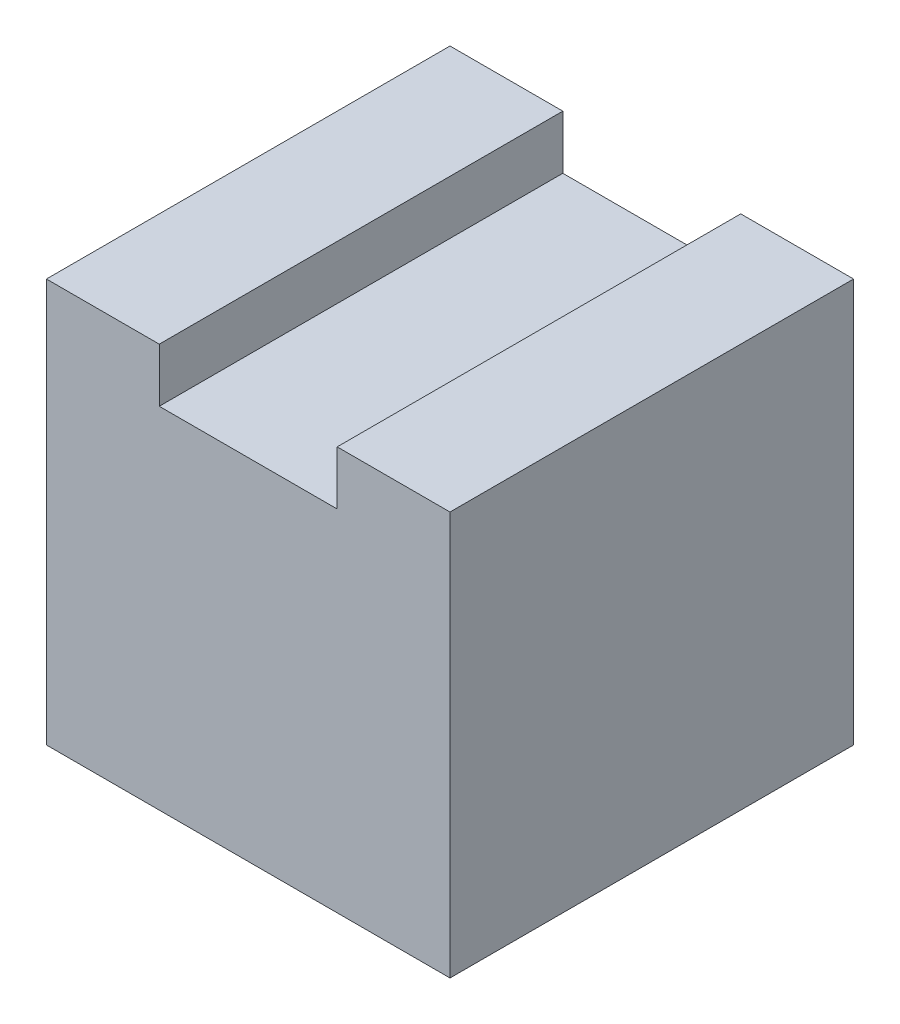
ISO-10303-21;
HEADER;
FILE_DESCRIPTION(('STEP AP214'),'2;1');
FILE_NAME('part.step','',(''),(''),'','','');
FILE_SCHEMA(('AUTOMOTIVE_DESIGN { 1 0 10303 214 1 1 1 1 }'));
ENDSEC;
DATA;
#1=APPLICATION_CONTEXT('core data for automotive mechanical design processes');
#2=APPLICATION_PROTOCOL_DEFINITION('international standard','automotive_design',2000,#1);
#3=PRODUCT_CONTEXT('',#1,'mechanical');
#4=PRODUCT('Part','Part','',(#3));
#5=PRODUCT_RELATED_PRODUCT_CATEGORY('part','',(#4));
#6=PRODUCT_DEFINITION_FORMATION('','',#4);
#7=PRODUCT_DEFINITION_CONTEXT('part definition',#1,'design');
#8=PRODUCT_DEFINITION('design','',#6,#7);
#9=PRODUCT_DEFINITION_SHAPE('','',#8);
#10=(LENGTH_UNIT() NAMED_UNIT(*) SI_UNIT(.MILLI.,.METRE.));
#11=(NAMED_UNIT(*) PLANE_ANGLE_UNIT() SI_UNIT($,.RADIAN.));
#12=(NAMED_UNIT(*) SI_UNIT($,.STERADIAN.) SOLID_ANGLE_UNIT());
#13=UNCERTAINTY_MEASURE_WITH_UNIT(LENGTH_MEASURE(1.E-05),#10,'distance_accuracy_value','');
#14=(GEOMETRIC_REPRESENTATION_CONTEXT(3) GLOBAL_UNCERTAINTY_ASSIGNED_CONTEXT((#13)) GLOBAL_UNIT_ASSIGNED_CONTEXT((#10,
#11,#12)) REPRESENTATION_CONTEXT('',''));
#15=CARTESIAN_POINT('',(0.,0.,0.));
#16=DIRECTION('',(0.,0.,1.));
#17=DIRECTION('',(1.,0.,0.));
#18=AXIS2_PLACEMENT_3D('',#15,#16,#17);
#19=CARTESIAN_POINT('',(0.,300.,0.));
#20=DIRECTION('',(0.,1.,0.));
#21=DIRECTION('',(0.,0.,1.));
#22=AXIS2_PLACEMENT_3D('',#19,#20,#21);
#23=PLANE('',#22);
#24=DIRECTION('',(0.,0.,1.));
#25=VECTOR('',#24,1.);
#26=CARTESIAN_POINT('',(-66.1284121491735,300.,150.));
#27=LINE('',#26,#25);
#28=CARTESIAN_POINT('',(-66.1284121491735,300.,-150.));
#29=VERTEX_POINT('',#28);
#30=CARTESIAN_POINT('',(-66.1284121491735,300.,150.));
#31=VERTEX_POINT('',#30);
#32=EDGE_CURVE('E130',#29,#31,#27,.T.);
#33=ORIENTED_EDGE('',*,*,#32,.F.);
#34=DIRECTION('',(-1.,0.,0.));
#35=VECTOR('',#34,1.);
#36=CARTESIAN_POINT('',(150.,300.,-150.));
#37=LINE('',#36,#35);
#38=CARTESIAN_POINT('',(-150.,300.,-150.));
#39=VERTEX_POINT('',#38);
#40=EDGE_CURVE('E211',#29,#39,#37,.T.);
#41=ORIENTED_EDGE('',*,*,#40,.T.);
#42=DIRECTION('',(0.,0.,1.));
#43=VECTOR('',#42,1.);
#44=CARTESIAN_POINT('',(-150.,300.,150.));
#45=LINE('',#44,#43);
#46=CARTESIAN_POINT('',(-150.,300.,150.));
#47=VERTEX_POINT('',#46);
#48=EDGE_CURVE('E202',#39,#47,#45,.T.);
#49=ORIENTED_EDGE('',*,*,#48,.T.);
#50=DIRECTION('',(1.,0.,0.));
#51=VECTOR('',#50,1.);
#52=CARTESIAN_POINT('',(150.,300.,150.));
#53=LINE('',#52,#51);
#54=EDGE_CURVE('E207',#47,#31,#53,.T.);
#55=ORIENTED_EDGE('',*,*,#54,.T.);
#56=EDGE_LOOP('',(#33,#41,#49,#55));
#57=FACE_BOUND('',#56,.T.);
#58=ADVANCED_FACE('F35',(#57),#23,.T.);
#59=CARTESIAN_POINT('',(0.,0.,0.));
#60=DIRECTION('',(0.,1.,0.));
#61=DIRECTION('',(0.,0.,1.));
#62=AXIS2_PLACEMENT_3D('',#59,#60,#61);
#63=PLANE('',#62);
#64=DIRECTION('',(0.,0.,1.));
#65=VECTOR('',#64,1.);
#66=CARTESIAN_POINT('',(-150.,0.,150.));
#67=LINE('',#66,#65);
#68=CARTESIAN_POINT('',(-150.,0.,-150.));
#69=VERTEX_POINT('',#68);
#70=CARTESIAN_POINT('',(-150.,0.,150.));
#71=VERTEX_POINT('',#70);
#72=EDGE_CURVE('E199',#69,#71,#67,.T.);
#73=ORIENTED_EDGE('',*,*,#72,.F.);
#74=DIRECTION('',(-1.,0.,0.));
#75=VECTOR('',#74,1.);
#76=CARTESIAN_POINT('',(150.,0.,-150.));
#77=LINE('',#76,#75);
#78=CARTESIAN_POINT('',(150.,0.,-150.));
#79=VERTEX_POINT('',#78);
#80=EDGE_CURVE('E206',#79,#69,#77,.T.);
#81=ORIENTED_EDGE('',*,*,#80,.F.);
#82=DIRECTION('',(0.,0.,-1.));
#83=VECTOR('',#82,1.);
#84=CARTESIAN_POINT('',(150.,0.,150.));
#85=LINE('',#84,#83);
#86=CARTESIAN_POINT('',(150.,0.,150.));
#87=VERTEX_POINT('',#86);
#88=EDGE_CURVE('E220',#87,#79,#85,.T.);
#89=ORIENTED_EDGE('',*,*,#88,.F.);
#90=DIRECTION('',(1.,0.,0.));
#91=VECTOR('',#90,1.);
#92=CARTESIAN_POINT('',(150.,0.,150.));
#93=LINE('',#92,#91);
#94=EDGE_CURVE('E218',#71,#87,#93,.T.);
#95=ORIENTED_EDGE('',*,*,#94,.F.);
#96=EDGE_LOOP('',(#73,#81,#89,#95));
#97=FACE_BOUND('',#96,.T.);
#98=CARTESIAN_POINT('',(-63.2723677706377,0.,59.7572362278255));
#99=DIRECTION('',(0.,1.,0.));
#100=DIRECTION('',(0.,0.,1.));
#101=AXIS2_PLACEMENT_3D('',#98,#99,#100);
#102=CIRCLE('',#101,79.8955451217629);
#103=CARTESIAN_POINT('',(-63.2723677706377,0.,139.652781349588));
#104=VERTEX_POINT('',#103);
#105=EDGE_CURVE('E193',#104,#104,#102,.T.);
#106=ORIENTED_EDGE('',*,*,#105,.T.);
#107=EDGE_LOOP('',(#106));
#108=FACE_BOUND('',#107,.T.);
#109=CARTESIAN_POINT('',(-70.7161757436539,0.,-86.2241090207699));
#110=DIRECTION('',(0.,-1.,0.));
#111=DIRECTION('',(0.,0.,-1.));
#112=AXIS2_PLACEMENT_3D('',#109,#110,#111);
#113=CIRCLE('',#112,50.);
#114=CARTESIAN_POINT('',(-70.7161757436539,0.,-136.22410902077));
#115=VERTEX_POINT('',#114);
#116=EDGE_CURVE('E189',#115,#115,#113,.T.);
#117=ORIENTED_EDGE('',*,*,#116,.F.);
#118=EDGE_LOOP('',(#117));
#119=FACE_BOUND('',#118,.T.);
#120=DIRECTION('',(-1.,0.,0.));
#121=VECTOR('',#120,1.);
#122=CARTESIAN_POINT('',(128.198915090835,0.,-137.503675057106));
#123=LINE('',#122,#121);
#124=CARTESIAN_POINT('',(128.198915090835,0.,-137.503675057106));
#125=VERTEX_POINT('',#124);
#126=CARTESIAN_POINT('',(54.5879251354521,0.,-137.503675057106));
#127=VERTEX_POINT('',#126);
#128=EDGE_CURVE('E58',#125,#127,#123,.T.);
#129=ORIENTED_EDGE('',*,*,#128,.T.);
#130=DIRECTION('',(0.,0.,1.));
#131=VECTOR('',#130,1.);
#132=CARTESIAN_POINT('',(54.5879251354521,0.,-137.503675057106));
#133=LINE('',#132,#131);
#134=CARTESIAN_POINT('',(54.5879251354521,0.,137.503675057106));
#135=VERTEX_POINT('',#134);
#136=EDGE_CURVE('E174',#127,#135,#133,.T.);
#137=ORIENTED_EDGE('',*,*,#136,.T.);
#138=DIRECTION('',(-1.,0.,0.));
#139=VECTOR('',#138,1.);
#140=CARTESIAN_POINT('',(128.198915090835,0.,137.503675057106));
#141=LINE('',#140,#139);
#142=CARTESIAN_POINT('',(128.198915090835,0.,137.503675057106));
#143=VERTEX_POINT('',#142);
#144=EDGE_CURVE('E177',#143,#135,#141,.T.);
#145=ORIENTED_EDGE('',*,*,#144,.F.);
#146=DIRECTION('',(0.,0.,1.));
#147=VECTOR('',#146,1.);
#148=CARTESIAN_POINT('',(128.198915090835,0.,-137.503675057106));
#149=LINE('',#148,#147);
#150=EDGE_CURVE('E164',#125,#143,#149,.T.);
#151=ORIENTED_EDGE('',*,*,#150,.F.);
#152=EDGE_LOOP('',(#129,#137,#145,#151));
#153=FACE_BOUND('',#152,.T.);
#154=ADVANCED_FACE('F237',(#97,#108,#119,#153),#63,.F.);
#155=CARTESIAN_POINT('',(-150.,300.,150.));
#156=DIRECTION('',(1.,0.,0.));
#157=DIRECTION('',(0.,0.,-1.));
#158=AXIS2_PLACEMENT_3D('',#155,#156,#157);
#159=PLANE('',#158);
#160=ORIENTED_EDGE('',*,*,#72,.T.);
#161=DIRECTION('',(0.,-1.,0.));
#162=VECTOR('',#161,1.);
#163=CARTESIAN_POINT('',(-150.,300.,150.));
#164=LINE('',#163,#162);
#165=EDGE_CURVE('E11',#47,#71,#164,.T.);
#166=ORIENTED_EDGE('',*,*,#165,.F.);
#167=ORIENTED_EDGE('',*,*,#48,.F.);
#168=DIRECTION('',(0.,-1.,0.));
#169=VECTOR('',#168,1.);
#170=CARTESIAN_POINT('',(-150.,300.,-150.));
#171=LINE('',#170,#169);
#172=EDGE_CURVE('E215',#39,#69,#171,.T.);
#173=ORIENTED_EDGE('',*,*,#172,.T.);
#174=EDGE_LOOP('',(#160,#166,#167,#173));
#175=FACE_BOUND('',#174,.T.);
#176=ADVANCED_FACE('F37',(#175),#159,.F.);
#177=CARTESIAN_POINT('',(150.,300.,150.));
#178=DIRECTION('',(0.,0.,-1.));
#179=DIRECTION('',(-1.,0.,0.));
#180=AXIS2_PLACEMENT_3D('',#177,#178,#179);
#181=PLANE('',#180);
#182=DIRECTION('',(1.,0.,0.));
#183=VECTOR('',#182,1.);
#184=CARTESIAN_POINT('',(66.1284121491735,260.,150.));
#185=LINE('',#184,#183);
#186=CARTESIAN_POINT('',(-66.1284121491735,260.,150.));
#187=VERTEX_POINT('',#186);
#188=CARTESIAN_POINT('',(66.1284121491735,260.,150.));
#189=VERTEX_POINT('',#188);
#190=EDGE_CURVE('E140',#187,#189,#185,.T.);
#191=ORIENTED_EDGE('',*,*,#190,.F.);
#192=DIRECTION('',(0.,1.,0.));
#193=VECTOR('',#192,1.);
#194=CARTESIAN_POINT('',(-66.1284121491735,260.,150.));
#195=LINE('',#194,#193);
#196=EDGE_CURVE('E124',#187,#31,#195,.T.);
#197=ORIENTED_EDGE('',*,*,#196,.T.);
#198=ORIENTED_EDGE('',*,*,#54,.F.);
#199=ORIENTED_EDGE('',*,*,#165,.T.);
#200=ORIENTED_EDGE('',*,*,#94,.T.);
#201=DIRECTION('',(0.,-1.,0.));
#202=VECTOR('',#201,1.);
#203=CARTESIAN_POINT('',(150.,300.,150.));
#204=LINE('',#203,#202);
#205=CARTESIAN_POINT('',(150.,300.,150.));
#206=VERTEX_POINT('',#205);
#207=EDGE_CURVE('E43',#206,#87,#204,.T.);
#208=ORIENTED_EDGE('',*,*,#207,.F.);
#209=CARTESIAN_POINT('',(66.1284121491735,300.,150.));
#210=VERTEX_POINT('',#209);
#211=EDGE_CURVE('E205',#210,#206,#53,.T.);
#212=ORIENTED_EDGE('',*,*,#211,.F.);
#213=DIRECTION('',(0.,1.,0.));
#214=VECTOR('',#213,1.);
#215=CARTESIAN_POINT('',(66.1284121491735,260.,150.));
#216=LINE('',#215,#214);
#217=EDGE_CURVE('E50',#189,#210,#216,.T.);
#218=ORIENTED_EDGE('',*,*,#217,.F.);
#219=EDGE_LOOP('',(#191,#197,#198,#199,#200,#208,#212,#218));
#220=FACE_BOUND('',#219,.T.);
#221=ADVANCED_FACE('F145',(#220),#181,.F.);
#222=CARTESIAN_POINT('',(150.,300.,150.));
#223=DIRECTION('',(-1.,0.,0.));
#224=DIRECTION('',(0.,0.,1.));
#225=AXIS2_PLACEMENT_3D('',#222,#223,#224);
#226=PLANE('',#225);
#227=ORIENTED_EDGE('',*,*,#88,.T.);
#228=DIRECTION('',(0.,-1.,0.));
#229=VECTOR('',#228,1.);
#230=CARTESIAN_POINT('',(150.,300.,-150.));
#231=LINE('',#230,#229);
#232=CARTESIAN_POINT('',(150.,300.,-150.));
#233=VERTEX_POINT('',#232);
#234=EDGE_CURVE('E225',#233,#79,#231,.T.);
#235=ORIENTED_EDGE('',*,*,#234,.F.);
#236=DIRECTION('',(0.,0.,-1.));
#237=VECTOR('',#236,1.);
#238=CARTESIAN_POINT('',(150.,300.,150.));
#239=LINE('',#238,#237);
#240=EDGE_CURVE('E209',#206,#233,#239,.T.);
#241=ORIENTED_EDGE('',*,*,#240,.F.);
#242=ORIENTED_EDGE('',*,*,#207,.T.);
#243=EDGE_LOOP('',(#227,#235,#241,#242));
#244=FACE_BOUND('',#243,.T.);
#245=ADVANCED_FACE('F232',(#244),#226,.F.);
#246=CARTESIAN_POINT('',(150.,300.,-150.));
#247=DIRECTION('',(0.,0.,1.));
#248=DIRECTION('',(1.,0.,0.));
#249=AXIS2_PLACEMENT_3D('',#246,#247,#248);
#250=PLANE('',#249);
#251=ORIENTED_EDGE('',*,*,#40,.F.);
#252=DIRECTION('',(0.,1.,0.));
#253=VECTOR('',#252,1.);
#254=CARTESIAN_POINT('',(-66.1284121491735,260.,-150.));
#255=LINE('',#254,#253);
#256=CARTESIAN_POINT('',(-66.1284121491735,260.,-150.));
#257=VERTEX_POINT('',#256);
#258=EDGE_CURVE('E154',#257,#29,#255,.T.);
#259=ORIENTED_EDGE('',*,*,#258,.F.);
#260=DIRECTION('',(-1.,0.,0.));
#261=VECTOR('',#260,1.);
#262=CARTESIAN_POINT('',(66.1284121491735,260.,-150.));
#263=LINE('',#262,#261);
#264=CARTESIAN_POINT('',(66.1284121491735,260.,-150.));
#265=VERTEX_POINT('',#264);
#266=EDGE_CURVE('E134',#265,#257,#263,.T.);
#267=ORIENTED_EDGE('',*,*,#266,.F.);
#268=DIRECTION('',(0.,1.,0.));
#269=VECTOR('',#268,1.);
#270=CARTESIAN_POINT('',(66.1284121491735,260.,-150.));
#271=LINE('',#270,#269);
#272=CARTESIAN_POINT('',(66.1284121491735,300.,-150.));
#273=VERTEX_POINT('',#272);
#274=EDGE_CURVE('E156',#265,#273,#271,.T.);
#275=ORIENTED_EDGE('',*,*,#274,.T.);
#276=EDGE_CURVE('E212',#233,#273,#37,.T.);
#277=ORIENTED_EDGE('',*,*,#276,.F.);
#278=ORIENTED_EDGE('',*,*,#234,.T.);
#279=ORIENTED_EDGE('',*,*,#80,.T.);
#280=ORIENTED_EDGE('',*,*,#172,.F.);
#281=EDGE_LOOP('',(#251,#259,#267,#275,#277,#278,#279,#280));
#282=FACE_BOUND('',#281,.T.);
#283=ADVANCED_FACE('F242',(#282),#250,.F.);
#284=DIRECTION('',(0.,0.,-1.));
#285=VECTOR('',#284,1.);
#286=CARTESIAN_POINT('',(66.1284121491735,300.,150.));
#287=LINE('',#286,#285);
#288=EDGE_CURVE('E143',#210,#273,#287,.T.);
#289=ORIENTED_EDGE('',*,*,#288,.F.);
#290=ORIENTED_EDGE('',*,*,#211,.T.);
#291=ORIENTED_EDGE('',*,*,#240,.T.);
#292=ORIENTED_EDGE('',*,*,#276,.T.);
#293=EDGE_LOOP('',(#289,#290,#291,#292));
#294=FACE_BOUND('',#293,.T.);
#295=ADVANCED_FACE('F249',(#294),#23,.T.);
#296=CARTESIAN_POINT('',(-63.2723677706377,99.9999999999999,59.7572362278255));
#297=DIRECTION('',(0.,-1.,0.));
#298=DIRECTION('',(0.,0.,-1.));
#299=AXIS2_PLACEMENT_3D('',#296,#297,#298);
#300=CYLINDRICAL_SURFACE('',#299,79.8955451217629);
#301=CARTESIAN_POINT('',(-63.2723677706377,99.9999999999999,59.7572362278255));
#302=DIRECTION('',(0.,1.,0.));
#303=DIRECTION('',(0.,0.,1.));
#304=AXIS2_PLACEMENT_3D('',#301,#302,#303);
#305=CIRCLE('',#304,79.8955451217629);
#306=CARTESIAN_POINT('',(-63.2723677706377,99.9999999999999,139.652781349588));
#307=VERTEX_POINT('',#306);
#308=EDGE_CURVE('E196',#307,#307,#305,.T.);
#309=ORIENTED_EDGE('',*,*,#308,.T.);
#310=EDGE_LOOP('',(#309));
#311=FACE_BOUND('',#310,.T.);
#312=ORIENTED_EDGE('',*,*,#105,.F.);
#313=EDGE_LOOP('',(#312));
#314=FACE_BOUND('',#313,.T.);
#315=ADVANCED_FACE('F268',(#311,#314),#300,.F.);
#316=CARTESIAN_POINT('',(-63.2723677706377,99.9999999999999,59.7572362278255));
#317=DIRECTION('',(0.,1.,0.));
#318=DIRECTION('',(0.,0.,1.));
#319=AXIS2_PLACEMENT_3D('',#316,#317,#318);
#320=PLANE('',#319);
#321=ORIENTED_EDGE('',*,*,#308,.F.);
#322=EDGE_LOOP('',(#321));
#323=FACE_BOUND('',#322,.T.);
#324=ADVANCED_FACE('F273',(#323),#320,.F.);
#325=CARTESIAN_POINT('',(-70.7161757436539,99.9999999999999,-86.2241090207699));
#326=DIRECTION('',(0.,-1.,0.));
#327=DIRECTION('',(0.,0.,-1.));
#328=AXIS2_PLACEMENT_3D('',#325,#326,#327);
#329=CYLINDRICAL_SURFACE('',#328,50.);
#330=CARTESIAN_POINT('',(-70.7161757436539,99.9999999999999,-86.2241090207699));
#331=DIRECTION('',(0.,-1.,0.));
#332=DIRECTION('',(0.,0.,-1.));
#333=AXIS2_PLACEMENT_3D('',#330,#331,#332);
#334=CIRCLE('',#333,50.);
#335=CARTESIAN_POINT('',(-70.7161757436539,99.9999999999999,-136.22410902077));
#336=VERTEX_POINT('',#335);
#337=EDGE_CURVE('E190',#336,#336,#334,.T.);
#338=ORIENTED_EDGE('',*,*,#337,.F.);
#339=EDGE_LOOP('',(#338));
#340=FACE_BOUND('',#339,.T.);
#341=ORIENTED_EDGE('',*,*,#116,.T.);
#342=EDGE_LOOP('',(#341));
#343=FACE_BOUND('',#342,.T.);
#344=ADVANCED_FACE('F300',(#340,#343),#329,.F.);
#345=CARTESIAN_POINT('',(-70.7161757436539,99.9999999999999,-86.2241090207699));
#346=DIRECTION('',(0.,-1.,0.));
#347=DIRECTION('',(0.,0.,-1.));
#348=AXIS2_PLACEMENT_3D('',#345,#346,#347);
#349=PLANE('',#348);
#350=ORIENTED_EDGE('',*,*,#337,.T.);
#351=EDGE_LOOP('',(#350));
#352=FACE_BOUND('',#351,.T.);
#353=ADVANCED_FACE('F322',(#352),#349,.T.);
#354=CARTESIAN_POINT('',(128.198915090835,80.,-137.503675057106));
#355=DIRECTION('',(0.,0.,1.));
#356=DIRECTION('',(1.,0.,0.));
#357=AXIS2_PLACEMENT_3D('',#354,#355,#356);
#358=PLANE('',#357);
#359=ORIENTED_EDGE('',*,*,#128,.F.);
#360=DIRECTION('',(0.,-1.,0.));
#361=VECTOR('',#360,1.);
#362=CARTESIAN_POINT('',(128.198915090835,80.,-137.503675057106));
#363=LINE('',#362,#361);
#364=CARTESIAN_POINT('',(128.198915090835,80.,-137.503675057106));
#365=VERTEX_POINT('',#364);
#366=EDGE_CURVE('E172',#365,#125,#363,.T.);
#367=ORIENTED_EDGE('',*,*,#366,.F.);
#368=DIRECTION('',(-1.,0.,0.));
#369=VECTOR('',#368,1.);
#370=CARTESIAN_POINT('',(128.198915090835,80.,-137.503675057106));
#371=LINE('',#370,#369);
#372=CARTESIAN_POINT('',(54.5879251354521,80.,-137.503675057106));
#373=VERTEX_POINT('',#372);
#374=EDGE_CURVE('E160',#365,#373,#371,.T.);
#375=ORIENTED_EDGE('',*,*,#374,.T.);
#376=DIRECTION('',(0.,-1.,0.));
#377=VECTOR('',#376,1.);
#378=CARTESIAN_POINT('',(54.5879251354521,80.,-137.503675057106));
#379=LINE('',#378,#377);
#380=EDGE_CURVE('E187',#373,#127,#379,.T.);
#381=ORIENTED_EDGE('',*,*,#380,.T.);
#382=EDGE_LOOP('',(#359,#367,#375,#381));
#383=FACE_BOUND('',#382,.T.);
#384=ADVANCED_FACE('F311',(#383),#358,.T.);
#385=CARTESIAN_POINT('',(54.5879251354521,80.,-137.503675057106));
#386=DIRECTION('',(1.,0.,0.));
#387=DIRECTION('',(0.,0.,-1.));
#388=AXIS2_PLACEMENT_3D('',#385,#386,#387);
#389=PLANE('',#388);
#390=ORIENTED_EDGE('',*,*,#136,.F.);
#391=ORIENTED_EDGE('',*,*,#380,.F.);
#392=DIRECTION('',(0.,0.,1.));
#393=VECTOR('',#392,1.);
#394=CARTESIAN_POINT('',(54.5879251354521,80.,-137.503675057106));
#395=LINE('',#394,#393);
#396=CARTESIAN_POINT('',(54.5879251354521,80.,137.503675057106));
#397=VERTEX_POINT('',#396);
#398=EDGE_CURVE('E163',#373,#397,#395,.T.);
#399=ORIENTED_EDGE('',*,*,#398,.T.);
#400=DIRECTION('',(0.,-1.,0.));
#401=VECTOR('',#400,1.);
#402=CARTESIAN_POINT('',(54.5879251354521,80.,137.503675057106));
#403=LINE('',#402,#401);
#404=EDGE_CURVE('E185',#397,#135,#403,.T.);
#405=ORIENTED_EDGE('',*,*,#404,.T.);
#406=EDGE_LOOP('',(#390,#391,#399,#405));
#407=FACE_BOUND('',#406,.T.);
#408=ADVANCED_FACE('F305',(#407),#389,.T.);
#409=CARTESIAN_POINT('',(128.198915090835,80.,137.503675057106));
#410=DIRECTION('',(0.,0.,1.));
#411=DIRECTION('',(1.,0.,0.));
#412=AXIS2_PLACEMENT_3D('',#409,#410,#411);
#413=PLANE('',#412);
#414=ORIENTED_EDGE('',*,*,#144,.T.);
#415=ORIENTED_EDGE('',*,*,#404,.F.);
#416=DIRECTION('',(-1.,0.,0.));
#417=VECTOR('',#416,1.);
#418=CARTESIAN_POINT('',(128.198915090835,80.,137.503675057106));
#419=LINE('',#418,#417);
#420=CARTESIAN_POINT('',(128.198915090835,80.,137.503675057106));
#421=VERTEX_POINT('',#420);
#422=EDGE_CURVE('E166',#421,#397,#419,.T.);
#423=ORIENTED_EDGE('',*,*,#422,.F.);
#424=DIRECTION('',(0.,-1.,0.));
#425=VECTOR('',#424,1.);
#426=CARTESIAN_POINT('',(128.198915090835,80.,137.503675057106));
#427=LINE('',#426,#425);
#428=EDGE_CURVE('E183',#421,#143,#427,.T.);
#429=ORIENTED_EDGE('',*,*,#428,.T.);
#430=EDGE_LOOP('',(#414,#415,#423,#429));
#431=FACE_BOUND('',#430,.T.);
#432=ADVANCED_FACE('F310',(#431),#413,.F.);
#433=CARTESIAN_POINT('',(128.198915090835,80.,-137.503675057106));
#434=DIRECTION('',(1.,0.,0.));
#435=DIRECTION('',(0.,0.,-1.));
#436=AXIS2_PLACEMENT_3D('',#433,#434,#435);
#437=PLANE('',#436);
#438=ORIENTED_EDGE('',*,*,#150,.T.);
#439=ORIENTED_EDGE('',*,*,#428,.F.);
#440=DIRECTION('',(0.,0.,1.));
#441=VECTOR('',#440,1.);
#442=CARTESIAN_POINT('',(128.198915090835,80.,-137.503675057106));
#443=LINE('',#442,#441);
#444=EDGE_CURVE('E169',#365,#421,#443,.T.);
#445=ORIENTED_EDGE('',*,*,#444,.F.);
#446=ORIENTED_EDGE('',*,*,#366,.T.);
#447=EDGE_LOOP('',(#438,#439,#445,#446));
#448=FACE_BOUND('',#447,.T.);
#449=ADVANCED_FACE('F332',(#448),#437,.F.);
#450=CARTESIAN_POINT('',(0.,80.,0.));
#451=DIRECTION('',(0.,1.,0.));
#452=DIRECTION('',(0.,0.,1.));
#453=AXIS2_PLACEMENT_3D('',#450,#451,#452);
#454=PLANE('',#453);
#455=ORIENTED_EDGE('',*,*,#374,.F.);
#456=ORIENTED_EDGE('',*,*,#444,.T.);
#457=ORIENTED_EDGE('',*,*,#422,.T.);
#458=ORIENTED_EDGE('',*,*,#398,.F.);
#459=EDGE_LOOP('',(#455,#456,#457,#458));
#460=FACE_BOUND('',#459,.T.);
#461=ADVANCED_FACE('F258',(#460),#454,.F.);
#462=CARTESIAN_POINT('',(-66.1284121491735,260.,150.));
#463=DIRECTION('',(-1.,0.,0.));
#464=DIRECTION('',(0.,0.,1.));
#465=AXIS2_PLACEMENT_3D('',#462,#463,#464);
#466=PLANE('',#465);
#467=ORIENTED_EDGE('',*,*,#32,.T.);
#468=ORIENTED_EDGE('',*,*,#196,.F.);
#469=DIRECTION('',(0.,0.,1.));
#470=VECTOR('',#469,1.);
#471=CARTESIAN_POINT('',(-66.1284121491735,260.,150.));
#472=LINE('',#471,#470);
#473=EDGE_CURVE('E127',#257,#187,#472,.T.);
#474=ORIENTED_EDGE('',*,*,#473,.F.);
#475=ORIENTED_EDGE('',*,*,#258,.T.);
#476=EDGE_LOOP('',(#467,#468,#474,#475));
#477=FACE_BOUND('',#476,.T.);
#478=ADVANCED_FACE('F126',(#477),#466,.F.);
#479=CARTESIAN_POINT('',(66.1284121491735,260.,150.));
#480=DIRECTION('',(1.,0.,0.));
#481=DIRECTION('',(0.,0.,-1.));
#482=AXIS2_PLACEMENT_3D('',#479,#480,#481);
#483=PLANE('',#482);
#484=ORIENTED_EDGE('',*,*,#288,.T.);
#485=ORIENTED_EDGE('',*,*,#274,.F.);
#486=DIRECTION('',(0.,0.,-1.));
#487=VECTOR('',#486,1.);
#488=CARTESIAN_POINT('',(66.1284121491735,260.,150.));
#489=LINE('',#488,#487);
#490=EDGE_CURVE('E147',#189,#265,#489,.T.);
#491=ORIENTED_EDGE('',*,*,#490,.F.);
#492=ORIENTED_EDGE('',*,*,#217,.T.);
#493=EDGE_LOOP('',(#484,#485,#491,#492));
#494=FACE_BOUND('',#493,.T.);
#495=ADVANCED_FACE('F250',(#494),#483,.F.);
#496=CARTESIAN_POINT('',(0.,260.,0.));
#497=DIRECTION('',(0.,1.,0.));
#498=DIRECTION('',(0.,0.,1.));
#499=AXIS2_PLACEMENT_3D('',#496,#497,#498);
#500=PLANE('',#499);
#501=ORIENTED_EDGE('',*,*,#473,.T.);
#502=ORIENTED_EDGE('',*,*,#190,.T.);
#503=ORIENTED_EDGE('',*,*,#490,.T.);
#504=ORIENTED_EDGE('',*,*,#266,.T.);
#505=EDGE_LOOP('',(#501,#502,#503,#504));
#506=FACE_BOUND('',#505,.T.);
#507=ADVANCED_FACE('F138',(#506),#500,.T.);
#508=CLOSED_SHELL('',(#58,#154,#176,#221,#245,#283,#295,#315,#324,#344,#353,#384,#408,#432,#449,
#461,#478,#495,#507));
#509=MANIFOLD_SOLID_BREP('B2',#508);
#510=ADVANCED_BREP_SHAPE_REPRESENTATION('',(#18,#509),#14);
#511=SHAPE_DEFINITION_REPRESENTATION(#9,#510);
ENDSEC;
END-ISO-10303-21;
